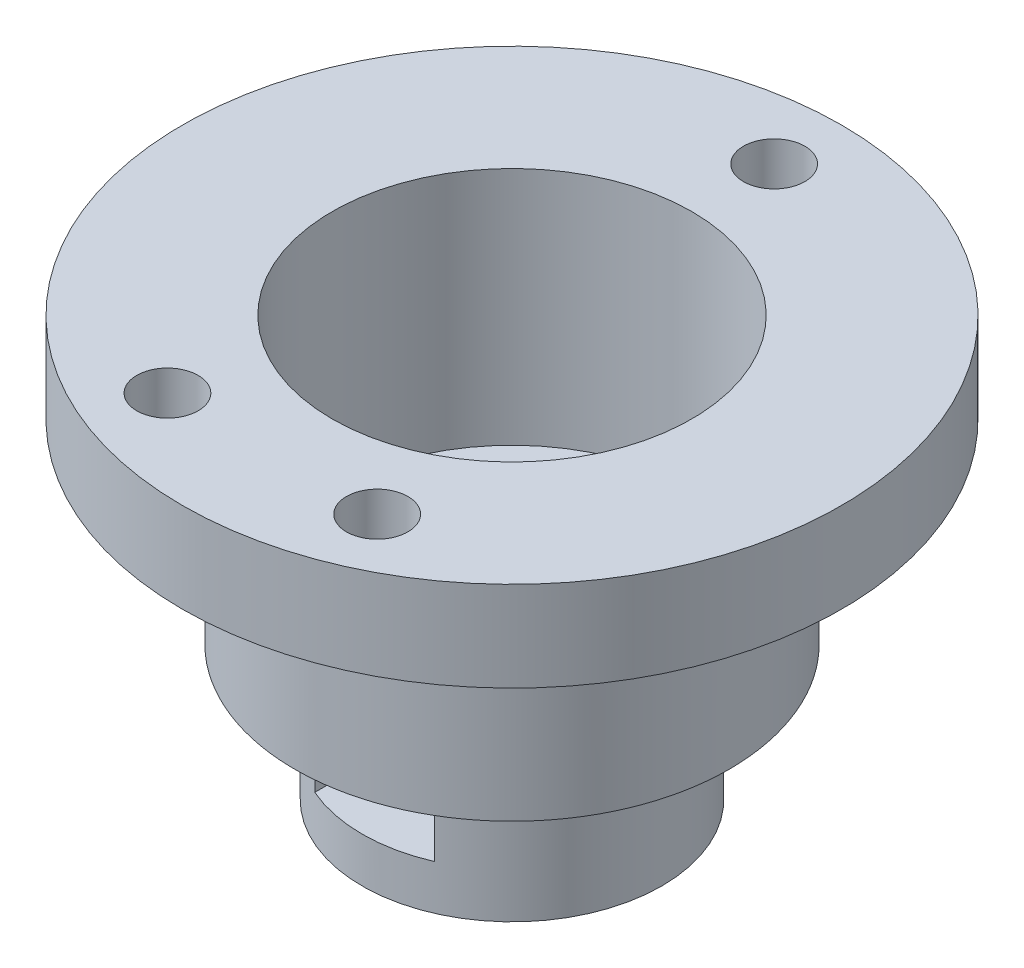
ISO-10303-21;
HEADER;
FILE_DESCRIPTION(('STEP AP214'),'2;1');
FILE_NAME('part.step','',(''),(''),'','','');
FILE_SCHEMA(('AUTOMOTIVE_DESIGN { 1 0 10303 214 1 1 1 1 }'));
ENDSEC;
DATA;
#1=APPLICATION_CONTEXT('core data for automotive mechanical design processes');
#2=APPLICATION_PROTOCOL_DEFINITION('international standard','automotive_design',2000,#1);
#3=PRODUCT_CONTEXT('',#1,'mechanical');
#4=PRODUCT('Part','Part','',(#3));
#5=PRODUCT_RELATED_PRODUCT_CATEGORY('part','',(#4));
#6=PRODUCT_DEFINITION_FORMATION('','',#4);
#7=PRODUCT_DEFINITION_CONTEXT('part definition',#1,'design');
#8=PRODUCT_DEFINITION('design','',#6,#7);
#9=PRODUCT_DEFINITION_SHAPE('','',#8);
#10=(LENGTH_UNIT() NAMED_UNIT(*) SI_UNIT(.MILLI.,.METRE.));
#11=(NAMED_UNIT(*) PLANE_ANGLE_UNIT() SI_UNIT($,.RADIAN.));
#12=(NAMED_UNIT(*) SI_UNIT($,.STERADIAN.) SOLID_ANGLE_UNIT());
#13=UNCERTAINTY_MEASURE_WITH_UNIT(LENGTH_MEASURE(1.E-05),#10,'distance_accuracy_value','');
#14=(GEOMETRIC_REPRESENTATION_CONTEXT(3) GLOBAL_UNCERTAINTY_ASSIGNED_CONTEXT((#13)) GLOBAL_UNIT_ASSIGNED_CONTEXT((#10,
#11,#12)) REPRESENTATION_CONTEXT('',''));
#15=CARTESIAN_POINT('',(0.,0.,0.));
#16=DIRECTION('',(0.,0.,1.));
#17=DIRECTION('',(1.,0.,0.));
#18=AXIS2_PLACEMENT_3D('',#15,#16,#17);
#19=CARTESIAN_POINT('',(0.,9.,0.));
#20=DIRECTION('',(0.,-1.,0.));
#21=DIRECTION('',(0.,0.,-1.));
#22=AXIS2_PLACEMENT_3D('',#19,#20,#21);
#23=CYLINDRICAL_SURFACE('',#22,10.);
#24=CARTESIAN_POINT('',(0.,9.,0.));
#25=DIRECTION('',(0.,1.,0.));
#26=DIRECTION('',(0.,0.,1.));
#27=AXIS2_PLACEMENT_3D('',#24,#25,#26);
#28=CIRCLE('',#27,10.);
#29=CARTESIAN_POINT('',(-9.88685996664259,9.,1.5));
#30=VERTEX_POINT('',#29);
#31=CARTESIAN_POINT('',(-9.88685996664259,9.,-1.5));
#32=VERTEX_POINT('',#31);
#33=EDGE_CURVE('E201',#30,#32,#28,.T.);
#34=ORIENTED_EDGE('',*,*,#33,.F.);
#35=DIRECTION('',(0.,-1.,0.));
#36=VECTOR('',#35,1.);
#37=CARTESIAN_POINT('',(-9.88685996664259,22.002,1.5));
#38=LINE('',#37,#36);
#39=CARTESIAN_POINT('',(-9.88685996664259,0.,1.5));
#40=VERTEX_POINT('',#39);
#41=EDGE_CURVE('E174',#30,#40,#38,.T.);
#42=ORIENTED_EDGE('',*,*,#41,.T.);
#43=CARTESIAN_POINT('',(0.,0.,0.));
#44=DIRECTION('',(0.,1.,0.));
#45=DIRECTION('',(0.,0.,1.));
#46=AXIS2_PLACEMENT_3D('',#43,#44,#45);
#47=CIRCLE('',#46,10.);
#48=CARTESIAN_POINT('',(-9.88685996664259,0.,-1.5));
#49=VERTEX_POINT('',#48);
#50=EDGE_CURVE('E200',#40,#49,#47,.T.);
#51=ORIENTED_EDGE('',*,*,#50,.T.);
#52=DIRECTION('',(0.,-1.,0.));
#53=VECTOR('',#52,1.);
#54=CARTESIAN_POINT('',(-9.88685996664259,22.002,-1.5));
#55=LINE('',#54,#53);
#56=EDGE_CURVE('E178',#32,#49,#55,.T.);
#57=ORIENTED_EDGE('',*,*,#56,.F.);
#58=EDGE_LOOP('',(#34,#42,#51,#57));
#59=FACE_BOUND('',#58,.T.);
#60=CARTESIAN_POINT('',(0.,6.8,0.));
#61=DIRECTION('',(0.,-1.,0.));
#62=DIRECTION('',(0.,0.,-1.));
#63=AXIS2_PLACEMENT_3D('',#60,#61,#62);
#64=CIRCLE('',#63,10.);
#65=CARTESIAN_POINT('',(4.,6.8,9.16515138991168));
#66=VERTEX_POINT('',#65);
#67=CARTESIAN_POINT('',(-4.,6.8,9.16515138991168));
#68=VERTEX_POINT('',#67);
#69=EDGE_CURVE('E132',#66,#68,#64,.T.);
#70=ORIENTED_EDGE('',*,*,#69,.F.);
#71=DIRECTION('',(0.,-1.,0.));
#72=VECTOR('',#71,1.);
#73=CARTESIAN_POINT('',(4.,6.8,9.16515138991168));
#74=LINE('',#73,#72);
#75=CARTESIAN_POINT('',(4.,3.,9.16515138991168));
#76=VERTEX_POINT('',#75);
#77=EDGE_CURVE('E114',#66,#76,#74,.T.);
#78=ORIENTED_EDGE('',*,*,#77,.T.);
#79=CARTESIAN_POINT('',(0.,3.,0.));
#80=DIRECTION('',(0.,-1.,0.));
#81=DIRECTION('',(0.,0.,-1.));
#82=AXIS2_PLACEMENT_3D('',#79,#80,#81);
#83=CIRCLE('',#82,10.);
#84=CARTESIAN_POINT('',(-4.,3.,9.16515138991168));
#85=VERTEX_POINT('',#84);
#86=EDGE_CURVE('E147',#76,#85,#83,.T.);
#87=ORIENTED_EDGE('',*,*,#86,.T.);
#88=DIRECTION('',(0.,-1.,0.));
#89=VECTOR('',#88,1.);
#90=CARTESIAN_POINT('',(-4.,6.8,9.16515138991168));
#91=LINE('',#90,#89);
#92=EDGE_CURVE('E124',#68,#85,#91,.T.);
#93=ORIENTED_EDGE('',*,*,#92,.F.);
#94=EDGE_LOOP('',(#70,#78,#87,#93));
#95=FACE_BOUND('',#94,.T.);
#96=ADVANCED_FACE('F37',(#59,#95),#23,.T.);
#97=CARTESIAN_POINT('',(0.,0.,0.));
#98=DIRECTION('',(0.,1.,0.));
#99=DIRECTION('',(0.,0.,1.));
#100=AXIS2_PLACEMENT_3D('',#97,#98,#99);
#101=CYLINDRICAL_SURFACE('',#100,3.);
#102=CARTESIAN_POINT('',(0.,12.,0.));
#103=DIRECTION('',(0.,1.,0.));
#104=DIRECTION('',(0.,0.,1.));
#105=AXIS2_PLACEMENT_3D('',#102,#103,#104);
#106=CIRCLE('',#105,3.);
#107=CARTESIAN_POINT('',(0.,12.,3.));
#108=VERTEX_POINT('',#107);
#109=EDGE_CURVE('E188',#108,#108,#106,.T.);
#110=ORIENTED_EDGE('',*,*,#109,.T.);
#111=EDGE_LOOP('',(#110));
#112=FACE_BOUND('',#111,.T.);
#113=CARTESIAN_POINT('',(0.,6.8,0.));
#114=DIRECTION('',(0.,-1.,0.));
#115=DIRECTION('',(0.,0.,-1.));
#116=AXIS2_PLACEMENT_3D('',#113,#114,#115);
#117=CIRCLE('',#116,3.);
#118=CARTESIAN_POINT('',(0.,6.8,-3.));
#119=VERTEX_POINT('',#118);
#120=EDGE_CURVE('E40',#119,#119,#117,.F.);
#121=ORIENTED_EDGE('',*,*,#120,.F.);
#122=EDGE_LOOP('',(#121));
#123=FACE_BOUND('',#122,.T.);
#124=ADVANCED_FACE('F213',(#112,#123),#101,.F.);
#125=CARTESIAN_POINT('',(0.,0.,0.));
#126=DIRECTION('',(0.,1.,0.));
#127=DIRECTION('',(0.,0.,1.));
#128=AXIS2_PLACEMENT_3D('',#125,#126,#127);
#129=PLANE('',#128);
#130=CARTESIAN_POINT('',(0.,0.,0.));
#131=DIRECTION('',(0.,1.,0.));
#132=DIRECTION('',(0.,0.,1.));
#133=AXIS2_PLACEMENT_3D('',#130,#131,#132);
#134=CIRCLE('',#133,3.);
#135=CARTESIAN_POINT('',(0.,0.,3.));
#136=VERTEX_POINT('',#135);
#137=EDGE_CURVE('E189',#136,#136,#134,.T.);
#138=ORIENTED_EDGE('',*,*,#137,.T.);
#139=EDGE_LOOP('',(#138));
#140=FACE_BOUND('',#139,.T.);
#141=ORIENTED_EDGE('',*,*,#50,.F.);
#142=DIRECTION('',(-1.,0.,0.));
#143=VECTOR('',#142,1.);
#144=CARTESIAN_POINT('',(0.,0.,1.5));
#145=LINE('',#144,#143);
#146=CARTESIAN_POINT('',(-13.,0.,1.5));
#147=VERTEX_POINT('',#146);
#148=EDGE_CURVE('E167',#40,#147,#145,.T.);
#149=ORIENTED_EDGE('',*,*,#148,.T.);
#150=CARTESIAN_POINT('',(-13.,0.,0.));
#151=DIRECTION('',(0.,-1.,0.));
#152=DIRECTION('',(0.,0.,-1.));
#153=AXIS2_PLACEMENT_3D('',#150,#151,#152);
#154=CIRCLE('',#153,1.5);
#155=CARTESIAN_POINT('',(-13.,0.,-1.5));
#156=VERTEX_POINT('',#155);
#157=EDGE_CURVE('E164',#147,#156,#154,.T.);
#158=ORIENTED_EDGE('',*,*,#157,.T.);
#159=DIRECTION('',(-1.,0.,0.));
#160=VECTOR('',#159,1.);
#161=CARTESIAN_POINT('',(0.,0.,-1.5));
#162=LINE('',#161,#160);
#163=EDGE_CURVE('E168',#49,#156,#162,.T.);
#164=ORIENTED_EDGE('',*,*,#163,.F.);
#165=EDGE_LOOP('',(#141,#149,#158,#164));
#166=FACE_BOUND('',#165,.T.);
#167=ADVANCED_FACE('F215',(#140,#166),#129,.F.);
#168=CARTESIAN_POINT('',(0.,12.,0.));
#169=DIRECTION('',(0.,-1.,0.));
#170=DIRECTION('',(0.,0.,-1.));
#171=AXIS2_PLACEMENT_3D('',#168,#169,#170);
#172=CYLINDRICAL_SURFACE('',#171,14.5);
#173=CARTESIAN_POINT('',(0.,9.,0.));
#174=DIRECTION('',(0.,1.,0.));
#175=DIRECTION('',(0.,0.,1.));
#176=AXIS2_PLACEMENT_3D('',#173,#174,#175);
#177=CIRCLE('',#176,14.5);
#178=CARTESIAN_POINT('',(-14.5,9.,0.));
#179=VERTEX_POINT('',#178);
#180=EDGE_CURVE('E197',#179,#179,#177,.T.);
#181=ORIENTED_EDGE('',*,*,#180,.T.);
#182=EDGE_LOOP('',(#181));
#183=FACE_BOUND('',#182,.T.);
#184=CARTESIAN_POINT('',(0.,22.,0.));
#185=DIRECTION('',(0.,1.,0.));
#186=DIRECTION('',(0.,0.,1.));
#187=AXIS2_PLACEMENT_3D('',#184,#185,#186);
#188=CIRCLE('',#187,14.5);
#189=CARTESIAN_POINT('',(0.,22.,14.5));
#190=VERTEX_POINT('',#189);
#191=EDGE_CURVE('E192',#190,#190,#188,.T.);
#192=ORIENTED_EDGE('',*,*,#191,.F.);
#193=EDGE_LOOP('',(#192));
#194=FACE_BOUND('',#193,.T.);
#195=ADVANCED_FACE('F223',(#183,#194),#172,.T.);
#196=CARTESIAN_POINT('',(0.,9.,0.));
#197=DIRECTION('',(0.,1.,0.));
#198=DIRECTION('',(0.,0.,1.));
#199=AXIS2_PLACEMENT_3D('',#196,#197,#198);
#200=PLANE('',#199);
#201=CARTESIAN_POINT('',(-13.,9.,0.));
#202=DIRECTION('',(0.,1.,0.));
#203=DIRECTION('',(0.,0.,1.));
#204=AXIS2_PLACEMENT_3D('',#201,#202,#203);
#205=CIRCLE('',#204,1.5);
#206=CARTESIAN_POINT('',(-13.,9.,1.5));
#207=VERTEX_POINT('',#206);
#208=EDGE_CURVE('E183',#207,#179,#205,.F.);
#209=ORIENTED_EDGE('',*,*,#208,.F.);
#210=DIRECTION('',(-1.,0.,0.));
#211=VECTOR('',#210,1.);
#212=CARTESIAN_POINT('',(0.,9.,1.5));
#213=LINE('',#212,#211);
#214=EDGE_CURVE('E177',#30,#207,#213,.T.);
#215=ORIENTED_EDGE('',*,*,#214,.F.);
#216=ORIENTED_EDGE('',*,*,#33,.T.);
#217=DIRECTION('',(-1.,0.,0.));
#218=VECTOR('',#217,1.);
#219=CARTESIAN_POINT('',(0.,9.,-1.5));
#220=LINE('',#219,#218);
#221=CARTESIAN_POINT('',(-13.,9.,-1.5));
#222=VERTEX_POINT('',#221);
#223=EDGE_CURVE('E185',#32,#222,#220,.T.);
#224=ORIENTED_EDGE('',*,*,#223,.T.);
#225=CARTESIAN_POINT('',(-13.,9.,0.));
#226=DIRECTION('',(0.,1.,0.));
#227=DIRECTION('',(0.,0.,1.));
#228=AXIS2_PLACEMENT_3D('',#225,#226,#227);
#229=CIRCLE('',#228,1.5);
#230=EDGE_CURVE('E11',#222,#179,#229,.T.);
#231=ORIENTED_EDGE('',*,*,#230,.T.);
#232=ORIENTED_EDGE('',*,*,#180,.F.);
#233=EDGE_LOOP('',(#209,#215,#216,#224,#231,#232));
#234=FACE_BOUND('',#233,.T.);
#235=ADVANCED_FACE('F341',(#234),#200,.F.);
#236=CARTESIAN_POINT('',(0.,22.,0.));
#237=DIRECTION('',(0.,-1.,0.));
#238=DIRECTION('',(0.,0.,-1.));
#239=AXIS2_PLACEMENT_3D('',#236,#237,#238);
#240=CYLINDRICAL_SURFACE('',#239,12.);
#241=CARTESIAN_POINT('',(0.,12.,0.));
#242=DIRECTION('',(0.,1.,0.));
#243=DIRECTION('',(0.,0.,1.));
#244=AXIS2_PLACEMENT_3D('',#241,#242,#243);
#245=CIRCLE('',#244,12.);
#246=CARTESIAN_POINT('',(0.,12.,12.));
#247=VERTEX_POINT('',#246);
#248=EDGE_CURVE('E45',#247,#247,#245,.F.);
#249=ORIENTED_EDGE('',*,*,#248,.T.);
#250=EDGE_LOOP('',(#249));
#251=FACE_BOUND('',#250,.T.);
#252=CARTESIAN_POINT('',(0.,28.,0.));
#253=DIRECTION('',(0.,1.,0.));
#254=DIRECTION('',(0.,0.,1.));
#255=AXIS2_PLACEMENT_3D('',#252,#253,#254);
#256=CIRCLE('',#255,12.);
#257=CARTESIAN_POINT('',(0.,28.,12.));
#258=VERTEX_POINT('',#257);
#259=EDGE_CURVE('E309',#258,#258,#256,.T.);
#260=ORIENTED_EDGE('',*,*,#259,.T.);
#261=EDGE_LOOP('',(#260));
#262=FACE_BOUND('',#261,.T.);
#263=ADVANCED_FACE('F239',(#251,#262),#240,.F.);
#264=CARTESIAN_POINT('',(0.,12.,0.));
#265=DIRECTION('',(0.,1.,0.));
#266=DIRECTION('',(0.,0.,1.));
#267=AXIS2_PLACEMENT_3D('',#264,#265,#266);
#268=PLANE('',#267);
#269=ORIENTED_EDGE('',*,*,#109,.F.);
#270=EDGE_LOOP('',(#269));
#271=FACE_BOUND('',#270,.T.);
#272=ORIENTED_EDGE('',*,*,#248,.F.);
#273=EDGE_LOOP('',(#272));
#274=FACE_BOUND('',#273,.T.);
#275=ADVANCED_FACE('F230',(#271,#274),#268,.T.);
#276=CARTESIAN_POINT('',(0.,3.,0.));
#277=DIRECTION('',(0.,-1.,0.));
#278=DIRECTION('',(0.,0.,-1.));
#279=AXIS2_PLACEMENT_3D('',#276,#277,#278);
#280=CIRCLE('',#279,3.);
#281=CARTESIAN_POINT('',(0.,3.,-3.));
#282=VERTEX_POINT('',#281);
#283=EDGE_CURVE('E158',#282,#282,#280,.F.);
#284=ORIENTED_EDGE('',*,*,#283,.T.);
#285=EDGE_LOOP('',(#284));
#286=FACE_BOUND('',#285,.T.);
#287=ORIENTED_EDGE('',*,*,#137,.F.);
#288=EDGE_LOOP('',(#287));
#289=FACE_BOUND('',#288,.T.);
#290=ADVANCED_FACE('F218',(#286,#289),#101,.F.);
#291=CARTESIAN_POINT('',(0.,22.002,1.5));
#292=DIRECTION('',(0.,0.,1.));
#293=DIRECTION('',(1.,0.,0.));
#294=AXIS2_PLACEMENT_3D('',#291,#292,#293);
#295=PLANE('',#294);
#296=ORIENTED_EDGE('',*,*,#41,.F.);
#297=ORIENTED_EDGE('',*,*,#214,.T.);
#298=DIRECTION('',(0.,-1.,0.));
#299=VECTOR('',#298,1.);
#300=CARTESIAN_POINT('',(-13.,22.002,1.5));
#301=LINE('',#300,#299);
#302=EDGE_CURVE('E61',#207,#147,#301,.T.);
#303=ORIENTED_EDGE('',*,*,#302,.T.);
#304=ORIENTED_EDGE('',*,*,#148,.F.);
#305=EDGE_LOOP('',(#296,#297,#303,#304));
#306=FACE_BOUND('',#305,.T.);
#307=ADVANCED_FACE('F229',(#306),#295,.T.);
#308=CARTESIAN_POINT('',(0.,22.002,-1.5));
#309=DIRECTION('',(0.,0.,1.));
#310=DIRECTION('',(1.,0.,0.));
#311=AXIS2_PLACEMENT_3D('',#308,#309,#310);
#312=PLANE('',#311);
#313=ORIENTED_EDGE('',*,*,#223,.F.);
#314=ORIENTED_EDGE('',*,*,#56,.T.);
#315=ORIENTED_EDGE('',*,*,#163,.T.);
#316=DIRECTION('',(0.,-1.,0.));
#317=VECTOR('',#316,1.);
#318=CARTESIAN_POINT('',(-13.,22.002,-1.5));
#319=LINE('',#318,#317);
#320=EDGE_CURVE('E175',#222,#156,#319,.T.);
#321=ORIENTED_EDGE('',*,*,#320,.F.);
#322=EDGE_LOOP('',(#313,#314,#315,#321));
#323=FACE_BOUND('',#322,.T.);
#324=ADVANCED_FACE('F236',(#323),#312,.F.);
#325=CARTESIAN_POINT('',(-13.,22.002,0.));
#326=DIRECTION('',(0.,-1.,0.));
#327=DIRECTION('',(0.,0.,-1.));
#328=AXIS2_PLACEMENT_3D('',#325,#326,#327);
#329=CYLINDRICAL_SURFACE('',#328,1.5);
#330=ORIENTED_EDGE('',*,*,#208,.T.);
#331=ORIENTED_EDGE('',*,*,#230,.F.);
#332=ORIENTED_EDGE('',*,*,#320,.T.);
#333=ORIENTED_EDGE('',*,*,#157,.F.);
#334=ORIENTED_EDGE('',*,*,#302,.F.);
#335=EDGE_LOOP('',(#330,#331,#332,#333,#334));
#336=FACE_BOUND('',#335,.T.);
#337=ADVANCED_FACE('F231',(#336),#329,.T.);
#338=CARTESIAN_POINT('',(0.,6.8,0.));
#339=DIRECTION('',(0.,-1.,0.));
#340=DIRECTION('',(0.,0.,-1.));
#341=AXIS2_PLACEMENT_3D('',#338,#339,#340);
#342=PLANE('',#341);
#343=DIRECTION('',(0.,0.,1.));
#344=VECTOR('',#343,1.);
#345=CARTESIAN_POINT('',(4.,6.8,0.));
#346=LINE('',#345,#344);
#347=CARTESIAN_POINT('',(4.,6.8,-2.3094010767585));
#348=VERTEX_POINT('',#347);
#349=EDGE_CURVE('E117',#348,#66,#346,.T.);
#350=ORIENTED_EDGE('',*,*,#349,.T.);
#351=ORIENTED_EDGE('',*,*,#69,.T.);
#352=DIRECTION('',(0.,0.,-1.));
#353=VECTOR('',#352,1.);
#354=CARTESIAN_POINT('',(-4.,6.8,0.));
#355=LINE('',#354,#353);
#356=CARTESIAN_POINT('',(-4.,6.8,-2.3094010767585));
#357=VERTEX_POINT('',#356);
#358=EDGE_CURVE('E138',#68,#357,#355,.T.);
#359=ORIENTED_EDGE('',*,*,#358,.T.);
#360=DIRECTION('',(0.866025403784438,0.,-0.5));
#361=VECTOR('',#360,1.);
#362=CARTESIAN_POINT('',(-2.,6.8,-3.46410161513776));
#363=LINE('',#362,#361);
#364=CARTESIAN_POINT('',(0.,6.8,-4.61880215351701));
#365=VERTEX_POINT('',#364);
#366=EDGE_CURVE('E140',#357,#365,#363,.T.);
#367=ORIENTED_EDGE('',*,*,#366,.T.);
#368=DIRECTION('',(0.866025403784439,0.,0.5));
#369=VECTOR('',#368,1.);
#370=CARTESIAN_POINT('',(2.,6.8,-3.46410161513776));
#371=LINE('',#370,#369);
#372=EDGE_CURVE('E125',#365,#348,#371,.T.);
#373=ORIENTED_EDGE('',*,*,#372,.T.);
#374=EDGE_LOOP('',(#350,#351,#359,#367,#373));
#375=FACE_BOUND('',#374,.T.);
#376=ORIENTED_EDGE('',*,*,#120,.T.);
#377=EDGE_LOOP('',(#376));
#378=FACE_BOUND('',#377,.T.);
#379=ADVANCED_FACE('F129',(#375,#378),#342,.T.);
#380=CARTESIAN_POINT('',(0.,3.,0.));
#381=DIRECTION('',(0.,-1.,0.));
#382=DIRECTION('',(0.,0.,-1.));
#383=AXIS2_PLACEMENT_3D('',#380,#381,#382);
#384=PLANE('',#383);
#385=DIRECTION('',(0.,0.,1.));
#386=VECTOR('',#385,1.);
#387=CARTESIAN_POINT('',(4.,3.,0.));
#388=LINE('',#387,#386);
#389=CARTESIAN_POINT('',(4.,3.,-2.3094010767585));
#390=VERTEX_POINT('',#389);
#391=EDGE_CURVE('E120',#390,#76,#388,.T.);
#392=ORIENTED_EDGE('',*,*,#391,.F.);
#393=DIRECTION('',(0.866025403784439,0.,0.5));
#394=VECTOR('',#393,1.);
#395=CARTESIAN_POINT('',(2.,3.,-3.46410161513776));
#396=LINE('',#395,#394);
#397=CARTESIAN_POINT('',(0.,3.,-4.61880215351701));
#398=VERTEX_POINT('',#397);
#399=EDGE_CURVE('E136',#398,#390,#396,.T.);
#400=ORIENTED_EDGE('',*,*,#399,.F.);
#401=DIRECTION('',(0.866025403784438,0.,-0.5));
#402=VECTOR('',#401,1.);
#403=CARTESIAN_POINT('',(-2.,3.,-3.46410161513776));
#404=LINE('',#403,#402);
#405=CARTESIAN_POINT('',(-4.,3.,-2.3094010767585));
#406=VERTEX_POINT('',#405);
#407=EDGE_CURVE('E151',#406,#398,#404,.T.);
#408=ORIENTED_EDGE('',*,*,#407,.F.);
#409=DIRECTION('',(0.,0.,-1.));
#410=VECTOR('',#409,1.);
#411=CARTESIAN_POINT('',(-4.,3.,0.));
#412=LINE('',#411,#410);
#413=EDGE_CURVE('E53',#85,#406,#412,.T.);
#414=ORIENTED_EDGE('',*,*,#413,.F.);
#415=ORIENTED_EDGE('',*,*,#86,.F.);
#416=EDGE_LOOP('',(#392,#400,#408,#414,#415));
#417=FACE_BOUND('',#416,.T.);
#418=ORIENTED_EDGE('',*,*,#283,.F.);
#419=EDGE_LOOP('',(#418));
#420=FACE_BOUND('',#419,.T.);
#421=ADVANCED_FACE('F249',(#417,#420),#384,.F.);
#422=CARTESIAN_POINT('',(4.,6.8,0.));
#423=DIRECTION('',(1.,0.,0.));
#424=DIRECTION('',(0.,0.,-1.));
#425=AXIS2_PLACEMENT_3D('',#422,#423,#424);
#426=PLANE('',#425);
#427=ORIENTED_EDGE('',*,*,#391,.T.);
#428=ORIENTED_EDGE('',*,*,#77,.F.);
#429=ORIENTED_EDGE('',*,*,#349,.F.);
#430=DIRECTION('',(0.,-1.,0.));
#431=VECTOR('',#430,1.);
#432=CARTESIAN_POINT('',(4.,6.8,-2.3094010767585));
#433=LINE('',#432,#431);
#434=EDGE_CURVE('E156',#348,#390,#433,.T.);
#435=ORIENTED_EDGE('',*,*,#434,.T.);
#436=EDGE_LOOP('',(#427,#428,#429,#435));
#437=FACE_BOUND('',#436,.T.);
#438=ADVANCED_FACE('F116',(#437),#426,.F.);
#439=CARTESIAN_POINT('',(2.,6.8,-3.46410161513776));
#440=DIRECTION('',(0.5,0.,-0.866025403784439));
#441=DIRECTION('',(-0.866025403784439,0.,-0.5));
#442=AXIS2_PLACEMENT_3D('',#439,#440,#441);
#443=PLANE('',#442);
#444=ORIENTED_EDGE('',*,*,#399,.T.);
#445=ORIENTED_EDGE('',*,*,#434,.F.);
#446=ORIENTED_EDGE('',*,*,#372,.F.);
#447=DIRECTION('',(0.,-1.,0.));
#448=VECTOR('',#447,1.);
#449=CARTESIAN_POINT('',(0.,6.8,-4.61880215351701));
#450=LINE('',#449,#448);
#451=EDGE_CURVE('E159',#365,#398,#450,.T.);
#452=ORIENTED_EDGE('',*,*,#451,.T.);
#453=EDGE_LOOP('',(#444,#445,#446,#452));
#454=FACE_BOUND('',#453,.T.);
#455=ADVANCED_FACE('F255',(#454),#443,.F.);
#456=CARTESIAN_POINT('',(-2.,6.8,-3.46410161513776));
#457=DIRECTION('',(-0.5,0.,-0.866025403784438));
#458=DIRECTION('',(-0.866025403784439,0.,0.5));
#459=AXIS2_PLACEMENT_3D('',#456,#457,#458);
#460=PLANE('',#459);
#461=ORIENTED_EDGE('',*,*,#407,.T.);
#462=ORIENTED_EDGE('',*,*,#451,.F.);
#463=ORIENTED_EDGE('',*,*,#366,.F.);
#464=DIRECTION('',(0.,-1.,0.));
#465=VECTOR('',#464,1.);
#466=CARTESIAN_POINT('',(-4.,6.8,-2.3094010767585));
#467=LINE('',#466,#465);
#468=EDGE_CURVE('E161',#357,#406,#467,.T.);
#469=ORIENTED_EDGE('',*,*,#468,.T.);
#470=EDGE_LOOP('',(#461,#462,#463,#469));
#471=FACE_BOUND('',#470,.T.);
#472=ADVANCED_FACE('F260',(#471),#460,.F.);
#473=CARTESIAN_POINT('',(-4.,6.8,0.));
#474=DIRECTION('',(-1.,0.,0.));
#475=DIRECTION('',(0.,0.,1.));
#476=AXIS2_PLACEMENT_3D('',#473,#474,#475);
#477=PLANE('',#476);
#478=ORIENTED_EDGE('',*,*,#413,.T.);
#479=ORIENTED_EDGE('',*,*,#468,.F.);
#480=ORIENTED_EDGE('',*,*,#358,.F.);
#481=ORIENTED_EDGE('',*,*,#92,.T.);
#482=EDGE_LOOP('',(#478,#479,#480,#481));
#483=FACE_BOUND('',#482,.T.);
#484=ADVANCED_FACE('F256',(#483),#477,.F.);
#485=CARTESIAN_POINT('',(0.,28.,0.));
#486=DIRECTION('',(0.,1.,0.));
#487=DIRECTION('',(0.,0.,1.));
#488=AXIS2_PLACEMENT_3D('',#485,#486,#487);
#489=PLANE('',#488);
#490=CARTESIAN_POINT('',(0.,28.,-17.5));
#491=DIRECTION('',(0.,1.,0.));
#492=DIRECTION('',(0.,0.,1.));
#493=AXIS2_PLACEMENT_3D('',#490,#491,#492);
#494=CIRCLE('',#493,2.05);
#495=CARTESIAN_POINT('',(0.,28.,-15.45));
#496=VERTEX_POINT('',#495);
#497=EDGE_CURVE('E310',#496,#496,#494,.T.);
#498=ORIENTED_EDGE('',*,*,#497,.F.);
#499=EDGE_LOOP('',(#498));
#500=FACE_BOUND('',#499,.T.);
#501=CARTESIAN_POINT('',(-7.,28.,16.));
#502=DIRECTION('',(0.,1.,0.));
#503=DIRECTION('',(0.,0.,1.));
#504=AXIS2_PLACEMENT_3D('',#501,#502,#503);
#505=CIRCLE('',#504,2.05);
#506=CARTESIAN_POINT('',(-7.,28.,18.05));
#507=VERTEX_POINT('',#506);
#508=EDGE_CURVE('E321',#507,#507,#505,.T.);
#509=ORIENTED_EDGE('',*,*,#508,.F.);
#510=EDGE_LOOP('',(#509));
#511=FACE_BOUND('',#510,.T.);
#512=CARTESIAN_POINT('',(7.,28.,16.));
#513=DIRECTION('',(0.,1.,0.));
#514=DIRECTION('',(0.,0.,1.));
#515=AXIS2_PLACEMENT_3D('',#512,#513,#514);
#516=CIRCLE('',#515,2.05);
#517=CARTESIAN_POINT('',(7.,28.,18.05));
#518=VERTEX_POINT('',#517);
#519=EDGE_CURVE('E327',#518,#518,#516,.T.);
#520=ORIENTED_EDGE('',*,*,#519,.F.);
#521=EDGE_LOOP('',(#520));
#522=FACE_BOUND('',#521,.T.);
#523=CARTESIAN_POINT('',(0.,28.,0.));
#524=DIRECTION('',(0.,1.,0.));
#525=DIRECTION('',(0.,0.,1.));
#526=AXIS2_PLACEMENT_3D('',#523,#524,#525);
#527=CIRCLE('',#526,22.);
#528=CARTESIAN_POINT('',(0.,28.,22.));
#529=VERTEX_POINT('',#528);
#530=EDGE_CURVE('E148',#529,#529,#527,.T.);
#531=ORIENTED_EDGE('',*,*,#530,.T.);
#532=EDGE_LOOP('',(#531));
#533=FACE_BOUND('',#532,.T.);
#534=ORIENTED_EDGE('',*,*,#259,.F.);
#535=EDGE_LOOP('',(#534));
#536=FACE_BOUND('',#535,.T.);
#537=ADVANCED_FACE('F259',(#500,#511,#522,#533,#536),#489,.T.);
#538=CARTESIAN_POINT('',(0.,22.,0.));
#539=DIRECTION('',(0.,1.,0.));
#540=DIRECTION('',(0.,0.,1.));
#541=AXIS2_PLACEMENT_3D('',#538,#539,#540);
#542=PLANE('',#541);
#543=ORIENTED_EDGE('',*,*,#191,.T.);
#544=EDGE_LOOP('',(#543));
#545=FACE_BOUND('',#544,.T.);
#546=CARTESIAN_POINT('',(0.,22.,0.));
#547=DIRECTION('',(0.,1.,0.));
#548=DIRECTION('',(0.,0.,1.));
#549=AXIS2_PLACEMENT_3D('',#546,#547,#548);
#550=CIRCLE('',#549,22.);
#551=CARTESIAN_POINT('',(0.,22.,22.));
#552=VERTEX_POINT('',#551);
#553=EDGE_CURVE('E313',#552,#552,#550,.T.);
#554=ORIENTED_EDGE('',*,*,#553,.F.);
#555=EDGE_LOOP('',(#554));
#556=FACE_BOUND('',#555,.T.);
#557=ADVANCED_FACE('F274',(#545,#556),#542,.F.);
#558=CARTESIAN_POINT('',(0.,28.,0.));
#559=DIRECTION('',(0.,-1.,0.));
#560=DIRECTION('',(0.,0.,-1.));
#561=AXIS2_PLACEMENT_3D('',#558,#559,#560);
#562=CYLINDRICAL_SURFACE('',#561,22.);
#563=ORIENTED_EDGE('',*,*,#530,.F.);
#564=EDGE_LOOP('',(#563));
#565=FACE_BOUND('',#564,.T.);
#566=ORIENTED_EDGE('',*,*,#553,.T.);
#567=EDGE_LOOP('',(#566));
#568=FACE_BOUND('',#567,.T.);
#569=ADVANCED_FACE('F270',(#565,#568),#562,.T.);
#570=CARTESIAN_POINT('',(7.,23.,16.));
#571=DIRECTION('',(0.,1.,0.));
#572=DIRECTION('',(0.,0.,1.));
#573=AXIS2_PLACEMENT_3D('',#570,#571,#572);
#574=CYLINDRICAL_SURFACE('',#573,2.05);
#575=CARTESIAN_POINT('',(7.,23.,16.));
#576=DIRECTION('',(0.,1.,0.));
#577=DIRECTION('',(0.,0.,1.));
#578=AXIS2_PLACEMENT_3D('',#575,#576,#577);
#579=CIRCLE('',#578,2.05);
#580=CARTESIAN_POINT('',(7.,23.,18.05));
#581=VERTEX_POINT('',#580);
#582=EDGE_CURVE('E324',#581,#581,#579,.T.);
#583=ORIENTED_EDGE('',*,*,#582,.F.);
#584=EDGE_LOOP('',(#583));
#585=FACE_BOUND('',#584,.T.);
#586=ORIENTED_EDGE('',*,*,#519,.T.);
#587=EDGE_LOOP('',(#586));
#588=FACE_BOUND('',#587,.T.);
#589=ADVANCED_FACE('F273',(#585,#588),#574,.F.);
#590=CARTESIAN_POINT('',(7.,23.,16.));
#591=DIRECTION('',(0.,1.,0.));
#592=DIRECTION('',(0.,0.,1.));
#593=AXIS2_PLACEMENT_3D('',#590,#591,#592);
#594=PLANE('',#593);
#595=ORIENTED_EDGE('',*,*,#582,.T.);
#596=EDGE_LOOP('',(#595));
#597=FACE_BOUND('',#596,.T.);
#598=ADVANCED_FACE('F284',(#597),#594,.T.);
#599=CARTESIAN_POINT('',(-7.,23.,16.));
#600=DIRECTION('',(0.,1.,0.));
#601=DIRECTION('',(0.,0.,1.));
#602=AXIS2_PLACEMENT_3D('',#599,#600,#601);
#603=CYLINDRICAL_SURFACE('',#602,2.05);
#604=CARTESIAN_POINT('',(-7.,23.,16.));
#605=DIRECTION('',(0.,1.,0.));
#606=DIRECTION('',(0.,0.,1.));
#607=AXIS2_PLACEMENT_3D('',#604,#605,#606);
#608=CIRCLE('',#607,2.05);
#609=CARTESIAN_POINT('',(-7.,23.,18.05));
#610=VERTEX_POINT('',#609);
#611=EDGE_CURVE('E316',#610,#610,#608,.T.);
#612=ORIENTED_EDGE('',*,*,#611,.F.);
#613=EDGE_LOOP('',(#612));
#614=FACE_BOUND('',#613,.T.);
#615=ORIENTED_EDGE('',*,*,#508,.T.);
#616=EDGE_LOOP('',(#615));
#617=FACE_BOUND('',#616,.T.);
#618=ADVANCED_FACE('F288',(#614,#617),#603,.F.);
#619=CARTESIAN_POINT('',(-7.,23.,16.));
#620=DIRECTION('',(0.,1.,0.));
#621=DIRECTION('',(0.,0.,1.));
#622=AXIS2_PLACEMENT_3D('',#619,#620,#621);
#623=PLANE('',#622);
#624=ORIENTED_EDGE('',*,*,#611,.T.);
#625=EDGE_LOOP('',(#624));
#626=FACE_BOUND('',#625,.T.);
#627=ADVANCED_FACE('F292',(#626),#623,.T.);
#628=CARTESIAN_POINT('',(0.,23.,-17.5));
#629=DIRECTION('',(0.,1.,0.));
#630=DIRECTION('',(0.,0.,1.));
#631=AXIS2_PLACEMENT_3D('',#628,#629,#630);
#632=CYLINDRICAL_SURFACE('',#631,2.05);
#633=CARTESIAN_POINT('',(0.,23.,-17.5));
#634=DIRECTION('',(0.,1.,0.));
#635=DIRECTION('',(0.,0.,1.));
#636=AXIS2_PLACEMENT_3D('',#633,#634,#635);
#637=CIRCLE('',#636,2.05);
#638=CARTESIAN_POINT('',(0.,23.,-15.45));
#639=VERTEX_POINT('',#638);
#640=EDGE_CURVE('E308',#639,#639,#637,.T.);
#641=ORIENTED_EDGE('',*,*,#640,.F.);
#642=EDGE_LOOP('',(#641));
#643=FACE_BOUND('',#642,.T.);
#644=ORIENTED_EDGE('',*,*,#497,.T.);
#645=EDGE_LOOP('',(#644));
#646=FACE_BOUND('',#645,.T.);
#647=ADVANCED_FACE('F296',(#643,#646),#632,.F.);
#648=CARTESIAN_POINT('',(0.,23.,-17.5));
#649=DIRECTION('',(0.,1.,0.));
#650=DIRECTION('',(0.,0.,1.));
#651=AXIS2_PLACEMENT_3D('',#648,#649,#650);
#652=PLANE('',#651);
#653=ORIENTED_EDGE('',*,*,#640,.T.);
#654=EDGE_LOOP('',(#653));
#655=FACE_BOUND('',#654,.T.);
#656=ADVANCED_FACE('F300',(#655),#652,.T.);
#657=CLOSED_SHELL('',(#96,#124,#167,#195,#235,#263,#275,#290,#307,#324,#337,#379,#421,#438,#455,
#472,#484,#537,#557,#569,#589,#598,#618,#627,#647,#656));
#658=MANIFOLD_SOLID_BREP('B2',#657);
#659=ADVANCED_BREP_SHAPE_REPRESENTATION('',(#18,#658),#14);
#660=SHAPE_DEFINITION_REPRESENTATION(#9,#659);
ENDSEC;
END-ISO-10303-21;
